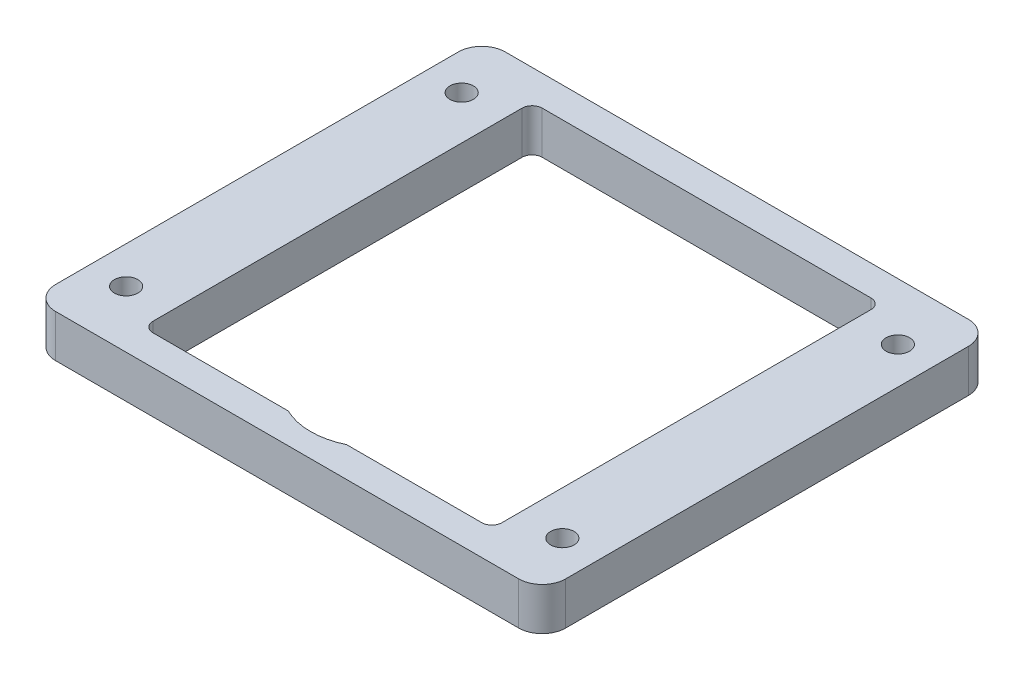
ISO-10303-21;
HEADER;
FILE_DESCRIPTION(('STEP AP214'),'2;1');
FILE_NAME('part.step','',(''),(''),'','','');
FILE_SCHEMA(('AUTOMOTIVE_DESIGN { 1 0 10303 214 1 1 1 1 }'));
ENDSEC;
DATA;
#1=APPLICATION_CONTEXT('core data for automotive mechanical design processes');
#2=APPLICATION_PROTOCOL_DEFINITION('international standard','automotive_design',2000,#1);
#3=PRODUCT_CONTEXT('',#1,'mechanical');
#4=PRODUCT('Part','Part','',(#3));
#5=PRODUCT_RELATED_PRODUCT_CATEGORY('part','',(#4));
#6=PRODUCT_DEFINITION_FORMATION('','',#4);
#7=PRODUCT_DEFINITION_CONTEXT('part definition',#1,'design');
#8=PRODUCT_DEFINITION('design','',#6,#7);
#9=PRODUCT_DEFINITION_SHAPE('','',#8);
#10=(LENGTH_UNIT() NAMED_UNIT(*) SI_UNIT(.MILLI.,.METRE.));
#11=(NAMED_UNIT(*) PLANE_ANGLE_UNIT() SI_UNIT($,.RADIAN.));
#12=(NAMED_UNIT(*) SI_UNIT($,.STERADIAN.) SOLID_ANGLE_UNIT());
#13=UNCERTAINTY_MEASURE_WITH_UNIT(LENGTH_MEASURE(1.E-05),#10,'distance_accuracy_value','');
#14=(GEOMETRIC_REPRESENTATION_CONTEXT(3) GLOBAL_UNCERTAINTY_ASSIGNED_CONTEXT((#13)) GLOBAL_UNIT_ASSIGNED_CONTEXT((#10,
#11,#12)) REPRESENTATION_CONTEXT('',''));
#15=CARTESIAN_POINT('',(0.,0.,0.));
#16=DIRECTION('',(0.,0.,1.));
#17=DIRECTION('',(1.,0.,0.));
#18=AXIS2_PLACEMENT_3D('',#15,#16,#17);
#19=CARTESIAN_POINT('',(24.5,6.35,29.));
#20=DIRECTION('',(0.,0.,-1.));
#21=DIRECTION('',(-1.,0.,0.));
#22=AXIS2_PLACEMENT_3D('',#19,#20,#21);
#23=PLANE('',#22);
#24=DIRECTION('',(0.,1.,0.));
#25=VECTOR('',#24,1.);
#26=CARTESIAN_POINT('',(-4.35889894354068,0.,29.));
#27=LINE('',#26,#25);
#28=CARTESIAN_POINT('',(-4.35889894354068,0.,29.));
#29=VERTEX_POINT('',#28);
#30=CARTESIAN_POINT('',(-4.35889894354068,6.35,29.));
#31=VERTEX_POINT('',#30);
#32=EDGE_CURVE('E11',#29,#31,#27,.T.);
#33=ORIENTED_EDGE('',*,*,#32,.F.);
#34=DIRECTION('',(1.,0.,0.));
#35=VECTOR('',#34,1.);
#36=CARTESIAN_POINT('',(24.5,0.,29.));
#37=LINE('',#36,#35);
#38=CARTESIAN_POINT('',(-24.5,0.,29.));
#39=VERTEX_POINT('',#38);
#40=EDGE_CURVE('E202',#39,#29,#37,.T.);
#41=ORIENTED_EDGE('',*,*,#40,.F.);
#42=DIRECTION('',(0.,-1.,0.));
#43=VECTOR('',#42,1.);
#44=CARTESIAN_POINT('',(-24.5,6.35,29.));
#45=LINE('',#44,#43);
#46=CARTESIAN_POINT('',(-24.5,6.35,29.));
#47=VERTEX_POINT('',#46);
#48=EDGE_CURVE('E174',#47,#39,#45,.T.);
#49=ORIENTED_EDGE('',*,*,#48,.F.);
#50=DIRECTION('',(1.,0.,0.));
#51=VECTOR('',#50,1.);
#52=CARTESIAN_POINT('',(24.5,6.35,29.));
#53=LINE('',#52,#51);
#54=EDGE_CURVE('E169',#47,#31,#53,.T.);
#55=ORIENTED_EDGE('',*,*,#54,.T.);
#56=EDGE_LOOP('',(#33,#41,#49,#55));
#57=FACE_BOUND('',#56,.T.);
#58=ADVANCED_FACE('F34',(#57),#23,.T.);
#59=CARTESIAN_POINT('',(34.5,6.35,-30.));
#60=DIRECTION('',(0.,1.,0.));
#61=DIRECTION('',(0.,0.,1.));
#62=AXIS2_PLACEMENT_3D('',#59,#60,#61);
#63=PLANE('',#62);
#64=CARTESIAN_POINT('',(0.,6.35,20.));
#65=DIRECTION('',(0.,1.,0.));
#66=DIRECTION('',(0.,0.,1.));
#67=AXIS2_PLACEMENT_3D('',#64,#65,#66);
#68=CIRCLE('',#67,10.);
#69=CARTESIAN_POINT('',(4.35889894354068,6.35,29.));
#70=VERTEX_POINT('',#69);
#71=EDGE_CURVE('E48',#31,#70,#68,.T.);
#72=ORIENTED_EDGE('',*,*,#71,.F.);
#73=ORIENTED_EDGE('',*,*,#54,.F.);
#74=CARTESIAN_POINT('',(-24.5,6.35,27.5));
#75=DIRECTION('',(0.,1.,0.));
#76=DIRECTION('',(0.,0.,-1.));
#77=AXIS2_PLACEMENT_3D('',#74,#75,#76);
#78=CIRCLE('',#77,1.5);
#79=CARTESIAN_POINT('',(-26.,6.35,27.5));
#80=VERTEX_POINT('',#79);
#81=EDGE_CURVE('E179',#80,#47,#78,.T.);
#82=ORIENTED_EDGE('',*,*,#81,.F.);
#83=DIRECTION('',(0.,0.,1.));
#84=VECTOR('',#83,1.);
#85=CARTESIAN_POINT('',(-26.,6.35,27.5));
#86=LINE('',#85,#84);
#87=CARTESIAN_POINT('',(-26.,6.35,-27.5));
#88=VERTEX_POINT('',#87);
#89=EDGE_CURVE('E311',#88,#80,#86,.T.);
#90=ORIENTED_EDGE('',*,*,#89,.F.);
#91=CARTESIAN_POINT('',(-24.5,6.35,-27.5));
#92=DIRECTION('',(0.,1.,0.));
#93=DIRECTION('',(0.,0.,1.));
#94=AXIS2_PLACEMENT_3D('',#91,#92,#93);
#95=CIRCLE('',#94,1.5);
#96=CARTESIAN_POINT('',(-24.5,6.35,-29.));
#97=VERTEX_POINT('',#96);
#98=EDGE_CURVE('E306',#97,#88,#95,.T.);
#99=ORIENTED_EDGE('',*,*,#98,.F.);
#100=DIRECTION('',(-1.,0.,0.));
#101=VECTOR('',#100,1.);
#102=CARTESIAN_POINT('',(24.5,6.35,-29.));
#103=LINE('',#102,#101);
#104=CARTESIAN_POINT('',(24.5,6.35,-29.));
#105=VERTEX_POINT('',#104);
#106=EDGE_CURVE('E304',#105,#97,#103,.T.);
#107=ORIENTED_EDGE('',*,*,#106,.F.);
#108=CARTESIAN_POINT('',(24.5,6.35,-27.5));
#109=DIRECTION('',(0.,1.,0.));
#110=DIRECTION('',(0.,0.,1.));
#111=AXIS2_PLACEMENT_3D('',#108,#109,#110);
#112=CIRCLE('',#111,1.5);
#113=CARTESIAN_POINT('',(26.,6.35,-27.5));
#114=VERTEX_POINT('',#113);
#115=EDGE_CURVE('E210',#114,#105,#112,.T.);
#116=ORIENTED_EDGE('',*,*,#115,.F.);
#117=DIRECTION('',(0.,0.,-1.));
#118=VECTOR('',#117,1.);
#119=CARTESIAN_POINT('',(26.,6.35,27.5));
#120=LINE('',#119,#118);
#121=CARTESIAN_POINT('',(26.,6.35,27.5));
#122=VERTEX_POINT('',#121);
#123=EDGE_CURVE('E177',#122,#114,#120,.T.);
#124=ORIENTED_EDGE('',*,*,#123,.F.);
#125=CARTESIAN_POINT('',(24.5,6.35,27.5));
#126=DIRECTION('',(0.,1.,0.));
#127=DIRECTION('',(0.,0.,1.));
#128=AXIS2_PLACEMENT_3D('',#125,#126,#127);
#129=CIRCLE('',#128,1.5);
#130=CARTESIAN_POINT('',(24.5,6.35,29.));
#131=VERTEX_POINT('',#130);
#132=EDGE_CURVE('E175',#131,#122,#129,.T.);
#133=ORIENTED_EDGE('',*,*,#132,.F.);
#134=EDGE_CURVE('E171',#70,#131,#53,.T.);
#135=ORIENTED_EDGE('',*,*,#134,.F.);
#136=EDGE_LOOP('',(#72,#73,#82,#90,#99,#107,#116,#124,#133,#135));
#137=FACE_BOUND('',#136,.T.);
#138=CARTESIAN_POINT('',(-32.5,6.35,25.));
#139=DIRECTION('',(0.,1.,0.));
#140=DIRECTION('',(0.,0.,1.));
#141=AXIS2_PLACEMENT_3D('',#138,#139,#140);
#142=CIRCLE('',#141,1.75);
#143=CARTESIAN_POINT('',(-32.5,6.35,26.75));
#144=VERTEX_POINT('',#143);
#145=EDGE_CURVE('E288',#144,#144,#142,.T.);
#146=ORIENTED_EDGE('',*,*,#145,.F.);
#147=EDGE_LOOP('',(#146));
#148=FACE_BOUND('',#147,.T.);
#149=CARTESIAN_POINT('',(-32.5,6.35,-25.));
#150=DIRECTION('',(0.,1.,0.));
#151=DIRECTION('',(0.,0.,1.));
#152=AXIS2_PLACEMENT_3D('',#149,#150,#151);
#153=CIRCLE('',#152,1.75);
#154=CARTESIAN_POINT('',(-32.5,6.35,-23.25));
#155=VERTEX_POINT('',#154);
#156=EDGE_CURVE('E555',#155,#155,#153,.T.);
#157=ORIENTED_EDGE('',*,*,#156,.F.);
#158=EDGE_LOOP('',(#157));
#159=FACE_BOUND('',#158,.T.);
#160=CARTESIAN_POINT('',(32.5,6.35,25.));
#161=DIRECTION('',(0.,1.,0.));
#162=DIRECTION('',(0.,0.,1.));
#163=AXIS2_PLACEMENT_3D('',#160,#161,#162);
#164=CIRCLE('',#163,1.75);
#165=CARTESIAN_POINT('',(32.5,6.35,26.75));
#166=VERTEX_POINT('',#165);
#167=EDGE_CURVE('E547',#166,#166,#164,.T.);
#168=ORIENTED_EDGE('',*,*,#167,.F.);
#169=EDGE_LOOP('',(#168));
#170=FACE_BOUND('',#169,.T.);
#171=CARTESIAN_POINT('',(32.5,6.35,-25.));
#172=DIRECTION('',(0.,1.,0.));
#173=DIRECTION('',(0.,0.,1.));
#174=AXIS2_PLACEMENT_3D('',#171,#172,#173);
#175=CIRCLE('',#174,1.75);
#176=CARTESIAN_POINT('',(32.5,6.35,-23.25));
#177=VERTEX_POINT('',#176);
#178=EDGE_CURVE('E543',#177,#177,#175,.T.);
#179=ORIENTED_EDGE('',*,*,#178,.F.);
#180=EDGE_LOOP('',(#179));
#181=FACE_BOUND('',#180,.T.);
#182=CARTESIAN_POINT('',(34.5,6.35,-30.));
#183=DIRECTION('',(0.,1.,0.));
#184=DIRECTION('',(0.,0.,1.));
#185=AXIS2_PLACEMENT_3D('',#182,#183,#184);
#186=CIRCLE('',#185,3.5);
#187=CARTESIAN_POINT('',(38.,6.35,-30.));
#188=VERTEX_POINT('',#187);
#189=CARTESIAN_POINT('',(34.5,6.35,-33.5));
#190=VERTEX_POINT('',#189);
#191=EDGE_CURVE('E228',#188,#190,#186,.T.);
#192=ORIENTED_EDGE('',*,*,#191,.T.);
#193=DIRECTION('',(-1.,0.,0.));
#194=VECTOR('',#193,1.);
#195=CARTESIAN_POINT('',(34.5,6.35,-33.5));
#196=LINE('',#195,#194);
#197=CARTESIAN_POINT('',(-34.5,6.35,-33.5));
#198=VERTEX_POINT('',#197);
#199=EDGE_CURVE('E231',#190,#198,#196,.T.);
#200=ORIENTED_EDGE('',*,*,#199,.T.);
#201=CARTESIAN_POINT('',(-34.5,6.35,-30.));
#202=DIRECTION('',(0.,1.,0.));
#203=DIRECTION('',(0.,0.,1.));
#204=AXIS2_PLACEMENT_3D('',#201,#202,#203);
#205=CIRCLE('',#204,3.5);
#206=CARTESIAN_POINT('',(-38.,6.35,-30.));
#207=VERTEX_POINT('',#206);
#208=EDGE_CURVE('E234',#198,#207,#205,.T.);
#209=ORIENTED_EDGE('',*,*,#208,.T.);
#210=DIRECTION('',(0.,0.,1.));
#211=VECTOR('',#210,1.);
#212=CARTESIAN_POINT('',(-38.,6.35,30.));
#213=LINE('',#212,#211);
#214=CARTESIAN_POINT('',(-38.,6.35,30.));
#215=VERTEX_POINT('',#214);
#216=EDGE_CURVE('E236',#207,#215,#213,.T.);
#217=ORIENTED_EDGE('',*,*,#216,.T.);
#218=CARTESIAN_POINT('',(-34.5,6.35,30.));
#219=DIRECTION('',(0.,1.,0.));
#220=DIRECTION('',(0.,0.,-1.));
#221=AXIS2_PLACEMENT_3D('',#218,#219,#220);
#222=CIRCLE('',#221,3.5);
#223=CARTESIAN_POINT('',(-34.5,6.35,33.5));
#224=VERTEX_POINT('',#223);
#225=EDGE_CURVE('E238',#215,#224,#222,.T.);
#226=ORIENTED_EDGE('',*,*,#225,.T.);
#227=DIRECTION('',(1.,0.,0.));
#228=VECTOR('',#227,1.);
#229=CARTESIAN_POINT('',(34.5,6.35,33.5));
#230=LINE('',#229,#228);
#231=CARTESIAN_POINT('',(34.5,6.35,33.5));
#232=VERTEX_POINT('',#231);
#233=EDGE_CURVE('E240',#224,#232,#230,.T.);
#234=ORIENTED_EDGE('',*,*,#233,.T.);
#235=CARTESIAN_POINT('',(34.5,6.35,30.));
#236=DIRECTION('',(0.,1.,0.));
#237=DIRECTION('',(0.,0.,1.));
#238=AXIS2_PLACEMENT_3D('',#235,#236,#237);
#239=CIRCLE('',#238,3.5);
#240=CARTESIAN_POINT('',(38.,6.35,30.));
#241=VERTEX_POINT('',#240);
#242=EDGE_CURVE('E242',#232,#241,#239,.T.);
#243=ORIENTED_EDGE('',*,*,#242,.T.);
#244=DIRECTION('',(0.,0.,-1.));
#245=VECTOR('',#244,1.);
#246=CARTESIAN_POINT('',(38.,6.35,30.));
#247=LINE('',#246,#245);
#248=EDGE_CURVE('E244',#241,#188,#247,.T.);
#249=ORIENTED_EDGE('',*,*,#248,.T.);
#250=EDGE_LOOP('',(#192,#200,#209,#217,#226,#234,#243,#249));
#251=FACE_BOUND('',#250,.T.);
#252=ADVANCED_FACE('F166',(#137,#148,#159,#170,#181,#251),#63,.T.);
#253=CARTESIAN_POINT('',(34.5,0.,-30.));
#254=DIRECTION('',(0.,1.,0.));
#255=DIRECTION('',(0.,0.,1.));
#256=AXIS2_PLACEMENT_3D('',#253,#254,#255);
#257=PLANE('',#256);
#258=CARTESIAN_POINT('',(-32.5,0.,25.));
#259=DIRECTION('',(0.,1.,0.));
#260=DIRECTION('',(0.,0.,1.));
#261=AXIS2_PLACEMENT_3D('',#258,#259,#260);
#262=CIRCLE('',#261,1.75);
#263=CARTESIAN_POINT('',(-32.5,0.,26.75));
#264=VERTEX_POINT('',#263);
#265=EDGE_CURVE('E558',#264,#264,#262,.T.);
#266=ORIENTED_EDGE('',*,*,#265,.T.);
#267=EDGE_LOOP('',(#266));
#268=FACE_BOUND('',#267,.T.);
#269=CARTESIAN_POINT('',(-32.5,0.,-25.));
#270=DIRECTION('',(0.,1.,0.));
#271=DIRECTION('',(0.,0.,1.));
#272=AXIS2_PLACEMENT_3D('',#269,#270,#271);
#273=CIRCLE('',#272,1.75);
#274=CARTESIAN_POINT('',(-32.5,0.,-23.25));
#275=VERTEX_POINT('',#274);
#276=EDGE_CURVE('E552',#275,#275,#273,.T.);
#277=ORIENTED_EDGE('',*,*,#276,.T.);
#278=EDGE_LOOP('',(#277));
#279=FACE_BOUND('',#278,.T.);
#280=CARTESIAN_POINT('',(32.5,0.,25.));
#281=DIRECTION('',(0.,1.,0.));
#282=DIRECTION('',(0.,0.,1.));
#283=AXIS2_PLACEMENT_3D('',#280,#281,#282);
#284=CIRCLE('',#283,1.75);
#285=CARTESIAN_POINT('',(32.5,0.,26.75));
#286=VERTEX_POINT('',#285);
#287=EDGE_CURVE('E545',#286,#286,#284,.T.);
#288=ORIENTED_EDGE('',*,*,#287,.T.);
#289=EDGE_LOOP('',(#288));
#290=FACE_BOUND('',#289,.T.);
#291=CARTESIAN_POINT('',(32.5,0.,-25.));
#292=DIRECTION('',(0.,1.,0.));
#293=DIRECTION('',(0.,0.,1.));
#294=AXIS2_PLACEMENT_3D('',#291,#292,#293);
#295=CIRCLE('',#294,1.75);
#296=CARTESIAN_POINT('',(32.5,0.,-23.25));
#297=VERTEX_POINT('',#296);
#298=EDGE_CURVE('E189',#297,#297,#295,.T.);
#299=ORIENTED_EDGE('',*,*,#298,.T.);
#300=EDGE_LOOP('',(#299));
#301=FACE_BOUND('',#300,.T.);
#302=CARTESIAN_POINT('',(34.5,0.,-30.));
#303=DIRECTION('',(0.,1.,0.));
#304=DIRECTION('',(0.,0.,1.));
#305=AXIS2_PLACEMENT_3D('',#302,#303,#304);
#306=CIRCLE('',#305,3.5);
#307=CARTESIAN_POINT('',(38.,0.,-30.));
#308=VERTEX_POINT('',#307);
#309=CARTESIAN_POINT('',(34.5,0.,-33.5));
#310=VERTEX_POINT('',#309);
#311=EDGE_CURVE('E227',#308,#310,#306,.T.);
#312=ORIENTED_EDGE('',*,*,#311,.F.);
#313=DIRECTION('',(0.,0.,-1.));
#314=VECTOR('',#313,1.);
#315=CARTESIAN_POINT('',(38.,0.,30.));
#316=LINE('',#315,#314);
#317=CARTESIAN_POINT('',(38.,0.,30.));
#318=VERTEX_POINT('',#317);
#319=EDGE_CURVE('E232',#318,#308,#316,.T.);
#320=ORIENTED_EDGE('',*,*,#319,.F.);
#321=CARTESIAN_POINT('',(34.5,0.,30.));
#322=DIRECTION('',(0.,1.,0.));
#323=DIRECTION('',(0.,0.,1.));
#324=AXIS2_PLACEMENT_3D('',#321,#322,#323);
#325=CIRCLE('',#324,3.5);
#326=CARTESIAN_POINT('',(34.5,0.,33.5));
#327=VERTEX_POINT('',#326);
#328=EDGE_CURVE('E259',#327,#318,#325,.T.);
#329=ORIENTED_EDGE('',*,*,#328,.F.);
#330=DIRECTION('',(1.,0.,0.));
#331=VECTOR('',#330,1.);
#332=CARTESIAN_POINT('',(34.5,0.,33.5));
#333=LINE('',#332,#331);
#334=CARTESIAN_POINT('',(-34.5,0.,33.5));
#335=VERTEX_POINT('',#334);
#336=EDGE_CURVE('E257',#335,#327,#333,.T.);
#337=ORIENTED_EDGE('',*,*,#336,.F.);
#338=CARTESIAN_POINT('',(-34.5,0.,30.));
#339=DIRECTION('',(0.,1.,0.));
#340=DIRECTION('',(0.,0.,-1.));
#341=AXIS2_PLACEMENT_3D('',#338,#339,#340);
#342=CIRCLE('',#341,3.5);
#343=CARTESIAN_POINT('',(-38.,0.,30.));
#344=VERTEX_POINT('',#343);
#345=EDGE_CURVE('E255',#344,#335,#342,.T.);
#346=ORIENTED_EDGE('',*,*,#345,.F.);
#347=DIRECTION('',(0.,0.,1.));
#348=VECTOR('',#347,1.);
#349=CARTESIAN_POINT('',(-38.,0.,30.));
#350=LINE('',#349,#348);
#351=CARTESIAN_POINT('',(-38.,0.,-30.));
#352=VERTEX_POINT('',#351);
#353=EDGE_CURVE('E253',#352,#344,#350,.T.);
#354=ORIENTED_EDGE('',*,*,#353,.F.);
#355=CARTESIAN_POINT('',(-34.5,0.,-30.));
#356=DIRECTION('',(0.,1.,0.));
#357=DIRECTION('',(0.,0.,1.));
#358=AXIS2_PLACEMENT_3D('',#355,#356,#357);
#359=CIRCLE('',#358,3.5);
#360=CARTESIAN_POINT('',(-34.5,0.,-33.5));
#361=VERTEX_POINT('',#360);
#362=EDGE_CURVE('E251',#361,#352,#359,.T.);
#363=ORIENTED_EDGE('',*,*,#362,.F.);
#364=DIRECTION('',(-1.,0.,0.));
#365=VECTOR('',#364,1.);
#366=CARTESIAN_POINT('',(34.5,0.,-33.5));
#367=LINE('',#366,#365);
#368=EDGE_CURVE('E249',#310,#361,#367,.T.);
#369=ORIENTED_EDGE('',*,*,#368,.F.);
#370=EDGE_LOOP('',(#312,#320,#329,#337,#346,#354,#363,#369));
#371=FACE_BOUND('',#370,.T.);
#372=ORIENTED_EDGE('',*,*,#40,.T.);
#373=CARTESIAN_POINT('',(0.,0.,20.));
#374=DIRECTION('',(0.,1.,0.));
#375=DIRECTION('',(0.,0.,1.));
#376=AXIS2_PLACEMENT_3D('',#373,#374,#375);
#377=CIRCLE('',#376,10.);
#378=CARTESIAN_POINT('',(4.35889894354068,0.,29.));
#379=VERTEX_POINT('',#378);
#380=EDGE_CURVE('E158',#29,#379,#377,.T.);
#381=ORIENTED_EDGE('',*,*,#380,.T.);
#382=CARTESIAN_POINT('',(24.5,0.,29.));
#383=VERTEX_POINT('',#382);
#384=EDGE_CURVE('E201',#379,#383,#37,.T.);
#385=ORIENTED_EDGE('',*,*,#384,.T.);
#386=CARTESIAN_POINT('',(24.5,0.,27.5));
#387=DIRECTION('',(0.,1.,0.));
#388=DIRECTION('',(0.,0.,1.));
#389=AXIS2_PLACEMENT_3D('',#386,#387,#388);
#390=CIRCLE('',#389,1.5);
#391=CARTESIAN_POINT('',(26.,0.,27.5));
#392=VERTEX_POINT('',#391);
#393=EDGE_CURVE('E204',#383,#392,#390,.T.);
#394=ORIENTED_EDGE('',*,*,#393,.T.);
#395=DIRECTION('',(0.,0.,-1.));
#396=VECTOR('',#395,1.);
#397=CARTESIAN_POINT('',(26.,0.,27.5));
#398=LINE('',#397,#396);
#399=CARTESIAN_POINT('',(26.,0.,-27.5));
#400=VERTEX_POINT('',#399);
#401=EDGE_CURVE('E207',#392,#400,#398,.T.);
#402=ORIENTED_EDGE('',*,*,#401,.T.);
#403=CARTESIAN_POINT('',(24.5,0.,-27.5));
#404=DIRECTION('',(0.,1.,0.));
#405=DIRECTION('',(0.,0.,1.));
#406=AXIS2_PLACEMENT_3D('',#403,#404,#405);
#407=CIRCLE('',#406,1.5);
#408=CARTESIAN_POINT('',(24.5,0.,-29.));
#409=VERTEX_POINT('',#408);
#410=EDGE_CURVE('E185',#400,#409,#407,.T.);
#411=ORIENTED_EDGE('',*,*,#410,.T.);
#412=DIRECTION('',(-1.,0.,0.));
#413=VECTOR('',#412,1.);
#414=CARTESIAN_POINT('',(24.5,0.,-29.));
#415=LINE('',#414,#413);
#416=CARTESIAN_POINT('',(-24.5,0.,-29.));
#417=VERTEX_POINT('',#416);
#418=EDGE_CURVE('E188',#409,#417,#415,.T.);
#419=ORIENTED_EDGE('',*,*,#418,.T.);
#420=CARTESIAN_POINT('',(-24.5,0.,-27.5));
#421=DIRECTION('',(0.,1.,0.));
#422=DIRECTION('',(0.,0.,1.));
#423=AXIS2_PLACEMENT_3D('',#420,#421,#422);
#424=CIRCLE('',#423,1.5);
#425=CARTESIAN_POINT('',(-26.,0.,-27.5));
#426=VERTEX_POINT('',#425);
#427=EDGE_CURVE('E192',#417,#426,#424,.T.);
#428=ORIENTED_EDGE('',*,*,#427,.T.);
#429=DIRECTION('',(0.,0.,1.));
#430=VECTOR('',#429,1.);
#431=CARTESIAN_POINT('',(-26.,0.,27.5));
#432=LINE('',#431,#430);
#433=CARTESIAN_POINT('',(-26.,0.,27.5));
#434=VERTEX_POINT('',#433);
#435=EDGE_CURVE('E195',#426,#434,#432,.T.);
#436=ORIENTED_EDGE('',*,*,#435,.T.);
#437=CARTESIAN_POINT('',(-24.5,0.,27.5));
#438=DIRECTION('',(0.,1.,0.));
#439=DIRECTION('',(0.,0.,-1.));
#440=AXIS2_PLACEMENT_3D('',#437,#438,#439);
#441=CIRCLE('',#440,1.5);
#442=EDGE_CURVE('E198',#434,#39,#441,.T.);
#443=ORIENTED_EDGE('',*,*,#442,.T.);
#444=EDGE_LOOP('',(#372,#381,#385,#394,#402,#411,#419,#428,#436,#443));
#445=FACE_BOUND('',#444,.T.);
#446=ADVANCED_FACE('F287',(#268,#279,#290,#301,#371,#445),#257,.F.);
#447=CARTESIAN_POINT('',(34.5,6.35,-30.));
#448=DIRECTION('',(0.,-1.,0.));
#449=DIRECTION('',(0.,0.,-1.));
#450=AXIS2_PLACEMENT_3D('',#447,#448,#449);
#451=CYLINDRICAL_SURFACE('',#450,3.5);
#452=ORIENTED_EDGE('',*,*,#311,.T.);
#453=DIRECTION('',(0.,-1.,0.));
#454=VECTOR('',#453,1.);
#455=CARTESIAN_POINT('',(34.5,6.35,-33.5));
#456=LINE('',#455,#454);
#457=EDGE_CURVE('E282',#190,#310,#456,.T.);
#458=ORIENTED_EDGE('',*,*,#457,.F.);
#459=ORIENTED_EDGE('',*,*,#191,.F.);
#460=DIRECTION('',(0.,-1.,0.));
#461=VECTOR('',#460,1.);
#462=CARTESIAN_POINT('',(38.,6.35,-30.));
#463=LINE('',#462,#461);
#464=EDGE_CURVE('E246',#188,#308,#463,.T.);
#465=ORIENTED_EDGE('',*,*,#464,.T.);
#466=EDGE_LOOP('',(#452,#458,#459,#465));
#467=FACE_BOUND('',#466,.T.);
#468=ADVANCED_FACE('F36',(#467),#451,.T.);
#469=CARTESIAN_POINT('',(34.5,6.35,-33.5));
#470=DIRECTION('',(0.,0.,1.));
#471=DIRECTION('',(1.,0.,0.));
#472=AXIS2_PLACEMENT_3D('',#469,#470,#471);
#473=PLANE('',#472);
#474=ORIENTED_EDGE('',*,*,#368,.T.);
#475=DIRECTION('',(0.,-1.,0.));
#476=VECTOR('',#475,1.);
#477=CARTESIAN_POINT('',(-34.5,6.35,-33.5));
#478=LINE('',#477,#476);
#479=EDGE_CURVE('E279',#198,#361,#478,.T.);
#480=ORIENTED_EDGE('',*,*,#479,.F.);
#481=ORIENTED_EDGE('',*,*,#199,.F.);
#482=ORIENTED_EDGE('',*,*,#457,.T.);
#483=EDGE_LOOP('',(#474,#480,#481,#482));
#484=FACE_BOUND('',#483,.T.);
#485=ADVANCED_FACE('F428',(#484),#473,.F.);
#486=CARTESIAN_POINT('',(-34.5,6.35,-30.));
#487=DIRECTION('',(0.,-1.,0.));
#488=DIRECTION('',(0.,0.,-1.));
#489=AXIS2_PLACEMENT_3D('',#486,#487,#488);
#490=CYLINDRICAL_SURFACE('',#489,3.5);
#491=ORIENTED_EDGE('',*,*,#362,.T.);
#492=DIRECTION('',(0.,-1.,0.));
#493=VECTOR('',#492,1.);
#494=CARTESIAN_POINT('',(-38.,6.35,-30.));
#495=LINE('',#494,#493);
#496=EDGE_CURVE('E276',#207,#352,#495,.T.);
#497=ORIENTED_EDGE('',*,*,#496,.F.);
#498=ORIENTED_EDGE('',*,*,#208,.F.);
#499=ORIENTED_EDGE('',*,*,#479,.T.);
#500=EDGE_LOOP('',(#491,#497,#498,#499));
#501=FACE_BOUND('',#500,.T.);
#502=ADVANCED_FACE('F418',(#501),#490,.T.);
#503=CARTESIAN_POINT('',(-38.,6.35,30.));
#504=DIRECTION('',(1.,0.,0.));
#505=DIRECTION('',(0.,0.,-1.));
#506=AXIS2_PLACEMENT_3D('',#503,#504,#505);
#507=PLANE('',#506);
#508=ORIENTED_EDGE('',*,*,#353,.T.);
#509=DIRECTION('',(0.,-1.,0.));
#510=VECTOR('',#509,1.);
#511=CARTESIAN_POINT('',(-38.,6.35,30.));
#512=LINE('',#511,#510);
#513=EDGE_CURVE('E273',#215,#344,#512,.T.);
#514=ORIENTED_EDGE('',*,*,#513,.F.);
#515=ORIENTED_EDGE('',*,*,#216,.F.);
#516=ORIENTED_EDGE('',*,*,#496,.T.);
#517=EDGE_LOOP('',(#508,#514,#515,#516));
#518=FACE_BOUND('',#517,.T.);
#519=ADVANCED_FACE('F408',(#518),#507,.F.);
#520=CARTESIAN_POINT('',(-34.5,6.35,30.));
#521=DIRECTION('',(0.,-1.,0.));
#522=DIRECTION('',(0.,0.,-1.));
#523=AXIS2_PLACEMENT_3D('',#520,#521,#522);
#524=CYLINDRICAL_SURFACE('',#523,3.5);
#525=ORIENTED_EDGE('',*,*,#345,.T.);
#526=DIRECTION('',(0.,-1.,0.));
#527=VECTOR('',#526,1.);
#528=CARTESIAN_POINT('',(-34.5,6.35,33.5));
#529=LINE('',#528,#527);
#530=EDGE_CURVE('E270',#224,#335,#529,.T.);
#531=ORIENTED_EDGE('',*,*,#530,.F.);
#532=ORIENTED_EDGE('',*,*,#225,.F.);
#533=ORIENTED_EDGE('',*,*,#513,.T.);
#534=EDGE_LOOP('',(#525,#531,#532,#533));
#535=FACE_BOUND('',#534,.T.);
#536=ADVANCED_FACE('F398',(#535),#524,.T.);
#537=CARTESIAN_POINT('',(34.5,6.35,33.5));
#538=DIRECTION('',(0.,0.,-1.));
#539=DIRECTION('',(-1.,0.,0.));
#540=AXIS2_PLACEMENT_3D('',#537,#538,#539);
#541=PLANE('',#540);
#542=ORIENTED_EDGE('',*,*,#336,.T.);
#543=DIRECTION('',(0.,-1.,0.));
#544=VECTOR('',#543,1.);
#545=CARTESIAN_POINT('',(34.5,6.35,33.5));
#546=LINE('',#545,#544);
#547=EDGE_CURVE('E267',#232,#327,#546,.T.);
#548=ORIENTED_EDGE('',*,*,#547,.F.);
#549=ORIENTED_EDGE('',*,*,#233,.F.);
#550=ORIENTED_EDGE('',*,*,#530,.T.);
#551=EDGE_LOOP('',(#542,#548,#549,#550));
#552=FACE_BOUND('',#551,.T.);
#553=ADVANCED_FACE('F388',(#552),#541,.F.);
#554=CARTESIAN_POINT('',(34.5,6.35,30.));
#555=DIRECTION('',(0.,-1.,0.));
#556=DIRECTION('',(0.,0.,-1.));
#557=AXIS2_PLACEMENT_3D('',#554,#555,#556);
#558=CYLINDRICAL_SURFACE('',#557,3.5);
#559=ORIENTED_EDGE('',*,*,#328,.T.);
#560=DIRECTION('',(0.,-1.,0.));
#561=VECTOR('',#560,1.);
#562=CARTESIAN_POINT('',(38.,6.35,30.));
#563=LINE('',#562,#561);
#564=EDGE_CURVE('E264',#241,#318,#563,.T.);
#565=ORIENTED_EDGE('',*,*,#564,.F.);
#566=ORIENTED_EDGE('',*,*,#242,.F.);
#567=ORIENTED_EDGE('',*,*,#547,.T.);
#568=EDGE_LOOP('',(#559,#565,#566,#567));
#569=FACE_BOUND('',#568,.T.);
#570=ADVANCED_FACE('F378',(#569),#558,.T.);
#571=CARTESIAN_POINT('',(38.,6.35,30.));
#572=DIRECTION('',(-1.,0.,0.));
#573=DIRECTION('',(0.,0.,1.));
#574=AXIS2_PLACEMENT_3D('',#571,#572,#573);
#575=PLANE('',#574);
#576=ORIENTED_EDGE('',*,*,#319,.T.);
#577=ORIENTED_EDGE('',*,*,#464,.F.);
#578=ORIENTED_EDGE('',*,*,#248,.F.);
#579=ORIENTED_EDGE('',*,*,#564,.T.);
#580=EDGE_LOOP('',(#576,#577,#578,#579));
#581=FACE_BOUND('',#580,.T.);
#582=ADVANCED_FACE('F334',(#581),#575,.F.);
#583=CARTESIAN_POINT('',(24.5,6.35,-27.5));
#584=DIRECTION('',(0.,-1.,0.));
#585=DIRECTION('',(0.,0.,-1.));
#586=AXIS2_PLACEMENT_3D('',#583,#584,#585);
#587=CYLINDRICAL_SURFACE('',#586,1.5);
#588=ORIENTED_EDGE('',*,*,#410,.F.);
#589=DIRECTION('',(0.,-1.,0.));
#590=VECTOR('',#589,1.);
#591=CARTESIAN_POINT('',(26.,6.35,-27.5));
#592=LINE('',#591,#590);
#593=EDGE_CURVE('E184',#114,#400,#592,.T.);
#594=ORIENTED_EDGE('',*,*,#593,.F.);
#595=ORIENTED_EDGE('',*,*,#115,.T.);
#596=DIRECTION('',(0.,-1.,0.));
#597=VECTOR('',#596,1.);
#598=CARTESIAN_POINT('',(24.5,6.35,-29.));
#599=LINE('',#598,#597);
#600=EDGE_CURVE('E224',#105,#409,#599,.T.);
#601=ORIENTED_EDGE('',*,*,#600,.T.);
#602=EDGE_LOOP('',(#588,#594,#595,#601));
#603=FACE_BOUND('',#602,.T.);
#604=ADVANCED_FACE('F300',(#603),#587,.F.);
#605=CARTESIAN_POINT('',(24.5,6.35,-29.));
#606=DIRECTION('',(0.,0.,1.));
#607=DIRECTION('',(1.,0.,0.));
#608=AXIS2_PLACEMENT_3D('',#605,#606,#607);
#609=PLANE('',#608);
#610=ORIENTED_EDGE('',*,*,#418,.F.);
#611=ORIENTED_EDGE('',*,*,#600,.F.);
#612=ORIENTED_EDGE('',*,*,#106,.T.);
#613=DIRECTION('',(0.,-1.,0.));
#614=VECTOR('',#613,1.);
#615=CARTESIAN_POINT('',(-24.5,6.35,-29.));
#616=LINE('',#615,#614);
#617=EDGE_CURVE('E222',#97,#417,#616,.T.);
#618=ORIENTED_EDGE('',*,*,#617,.T.);
#619=EDGE_LOOP('',(#610,#611,#612,#618));
#620=FACE_BOUND('',#619,.T.);
#621=ADVANCED_FACE('F326',(#620),#609,.T.);
#622=CARTESIAN_POINT('',(-24.5,6.35,-27.5));
#623=DIRECTION('',(0.,-1.,0.));
#624=DIRECTION('',(0.,0.,-1.));
#625=AXIS2_PLACEMENT_3D('',#622,#623,#624);
#626=CYLINDRICAL_SURFACE('',#625,1.5);
#627=ORIENTED_EDGE('',*,*,#427,.F.);
#628=ORIENTED_EDGE('',*,*,#617,.F.);
#629=ORIENTED_EDGE('',*,*,#98,.T.);
#630=DIRECTION('',(0.,-1.,0.));
#631=VECTOR('',#630,1.);
#632=CARTESIAN_POINT('',(-26.,6.35,-27.5));
#633=LINE('',#632,#631);
#634=EDGE_CURVE('E220',#88,#426,#633,.T.);
#635=ORIENTED_EDGE('',*,*,#634,.T.);
#636=EDGE_LOOP('',(#627,#628,#629,#635));
#637=FACE_BOUND('',#636,.T.);
#638=ADVANCED_FACE('F322',(#637),#626,.F.);
#639=CARTESIAN_POINT('',(-26.,6.35,27.5));
#640=DIRECTION('',(1.,0.,0.));
#641=DIRECTION('',(0.,0.,-1.));
#642=AXIS2_PLACEMENT_3D('',#639,#640,#641);
#643=PLANE('',#642);
#644=ORIENTED_EDGE('',*,*,#435,.F.);
#645=ORIENTED_EDGE('',*,*,#634,.F.);
#646=ORIENTED_EDGE('',*,*,#89,.T.);
#647=DIRECTION('',(0.,-1.,0.));
#648=VECTOR('',#647,1.);
#649=CARTESIAN_POINT('',(-26.,6.35,27.5));
#650=LINE('',#649,#648);
#651=EDGE_CURVE('E218',#80,#434,#650,.T.);
#652=ORIENTED_EDGE('',*,*,#651,.T.);
#653=EDGE_LOOP('',(#644,#645,#646,#652));
#654=FACE_BOUND('',#653,.T.);
#655=ADVANCED_FACE('F324',(#654),#643,.T.);
#656=CARTESIAN_POINT('',(-24.5,6.35,27.5));
#657=DIRECTION('',(0.,-1.,0.));
#658=DIRECTION('',(0.,0.,-1.));
#659=AXIS2_PLACEMENT_3D('',#656,#657,#658);
#660=CYLINDRICAL_SURFACE('',#659,1.5);
#661=ORIENTED_EDGE('',*,*,#442,.F.);
#662=ORIENTED_EDGE('',*,*,#651,.F.);
#663=ORIENTED_EDGE('',*,*,#81,.T.);
#664=ORIENTED_EDGE('',*,*,#48,.T.);
#665=EDGE_LOOP('',(#661,#662,#663,#664));
#666=FACE_BOUND('',#665,.T.);
#667=ADVANCED_FACE('F318',(#666),#660,.F.);
#668=DIRECTION('',(0.,1.,0.));
#669=VECTOR('',#668,1.);
#670=CARTESIAN_POINT('',(4.35889894354068,0.,29.));
#671=LINE('',#670,#669);
#672=EDGE_CURVE('E42',#70,#379,#671,.F.);
#673=ORIENTED_EDGE('',*,*,#672,.F.);
#674=ORIENTED_EDGE('',*,*,#134,.T.);
#675=DIRECTION('',(0.,-1.,0.));
#676=VECTOR('',#675,1.);
#677=CARTESIAN_POINT('',(24.5,6.35,29.));
#678=LINE('',#677,#676);
#679=EDGE_CURVE('E214',#131,#383,#678,.T.);
#680=ORIENTED_EDGE('',*,*,#679,.T.);
#681=ORIENTED_EDGE('',*,*,#384,.F.);
#682=EDGE_LOOP('',(#673,#674,#680,#681));
#683=FACE_BOUND('',#682,.T.);
#684=ADVANCED_FACE('F290',(#683),#23,.T.);
#685=CARTESIAN_POINT('',(24.5,6.35,27.5));
#686=DIRECTION('',(0.,-1.,0.));
#687=DIRECTION('',(0.,0.,-1.));
#688=AXIS2_PLACEMENT_3D('',#685,#686,#687);
#689=CYLINDRICAL_SURFACE('',#688,1.5);
#690=ORIENTED_EDGE('',*,*,#393,.F.);
#691=ORIENTED_EDGE('',*,*,#679,.F.);
#692=ORIENTED_EDGE('',*,*,#132,.T.);
#693=DIRECTION('',(0.,-1.,0.));
#694=VECTOR('',#693,1.);
#695=CARTESIAN_POINT('',(26.,6.35,27.5));
#696=LINE('',#695,#694);
#697=EDGE_CURVE('E56',#122,#392,#696,.T.);
#698=ORIENTED_EDGE('',*,*,#697,.T.);
#699=EDGE_LOOP('',(#690,#691,#692,#698));
#700=FACE_BOUND('',#699,.T.);
#701=ADVANCED_FACE('F294',(#700),#689,.F.);
#702=CARTESIAN_POINT('',(26.,6.35,27.5));
#703=DIRECTION('',(-1.,0.,0.));
#704=DIRECTION('',(0.,0.,1.));
#705=AXIS2_PLACEMENT_3D('',#702,#703,#704);
#706=PLANE('',#705);
#707=ORIENTED_EDGE('',*,*,#401,.F.);
#708=ORIENTED_EDGE('',*,*,#697,.F.);
#709=ORIENTED_EDGE('',*,*,#123,.T.);
#710=ORIENTED_EDGE('',*,*,#593,.T.);
#711=EDGE_LOOP('',(#707,#708,#709,#710));
#712=FACE_BOUND('',#711,.T.);
#713=ADVANCED_FACE('F295',(#712),#706,.T.);
#714=CARTESIAN_POINT('',(32.5,6.35,-25.));
#715=DIRECTION('',(0.,1.,0.));
#716=DIRECTION('',(0.,0.,1.));
#717=AXIS2_PLACEMENT_3D('',#714,#715,#716);
#718=CYLINDRICAL_SURFACE('',#717,1.75);
#719=ORIENTED_EDGE('',*,*,#298,.F.);
#720=EDGE_LOOP('',(#719));
#721=FACE_BOUND('',#720,.T.);
#722=ORIENTED_EDGE('',*,*,#178,.T.);
#723=EDGE_LOOP('',(#722));
#724=FACE_BOUND('',#723,.T.);
#725=ADVANCED_FACE('F494',(#721,#724),#718,.F.);
#726=CARTESIAN_POINT('',(32.5,6.35,25.));
#727=DIRECTION('',(0.,1.,0.));
#728=DIRECTION('',(0.,0.,1.));
#729=AXIS2_PLACEMENT_3D('',#726,#727,#728);
#730=CYLINDRICAL_SURFACE('',#729,1.75);
#731=ORIENTED_EDGE('',*,*,#287,.F.);
#732=EDGE_LOOP('',(#731));
#733=FACE_BOUND('',#732,.T.);
#734=ORIENTED_EDGE('',*,*,#167,.T.);
#735=EDGE_LOOP('',(#734));
#736=FACE_BOUND('',#735,.T.);
#737=ADVANCED_FACE('F484',(#733,#736),#730,.F.);
#738=CARTESIAN_POINT('',(-32.5,6.35,-25.));
#739=DIRECTION('',(0.,1.,0.));
#740=DIRECTION('',(0.,0.,1.));
#741=AXIS2_PLACEMENT_3D('',#738,#739,#740);
#742=CYLINDRICAL_SURFACE('',#741,1.75);
#743=ORIENTED_EDGE('',*,*,#276,.F.);
#744=EDGE_LOOP('',(#743));
#745=FACE_BOUND('',#744,.T.);
#746=ORIENTED_EDGE('',*,*,#156,.T.);
#747=EDGE_LOOP('',(#746));
#748=FACE_BOUND('',#747,.T.);
#749=ADVANCED_FACE('F473',(#745,#748),#742,.F.);
#750=CARTESIAN_POINT('',(-32.5,6.35,25.));
#751=DIRECTION('',(0.,1.,0.));
#752=DIRECTION('',(0.,0.,1.));
#753=AXIS2_PLACEMENT_3D('',#750,#751,#752);
#754=CYLINDRICAL_SURFACE('',#753,1.75);
#755=ORIENTED_EDGE('',*,*,#265,.F.);
#756=EDGE_LOOP('',(#755));
#757=FACE_BOUND('',#756,.T.);
#758=ORIENTED_EDGE('',*,*,#145,.T.);
#759=EDGE_LOOP('',(#758));
#760=FACE_BOUND('',#759,.T.);
#761=ADVANCED_FACE('F469',(#757,#760),#754,.F.);
#762=CARTESIAN_POINT('',(0.,0.,20.));
#763=DIRECTION('',(0.,1.,0.));
#764=DIRECTION('',(0.,0.,1.));
#765=AXIS2_PLACEMENT_3D('',#762,#763,#764);
#766=CYLINDRICAL_SURFACE('',#765,10.);
#767=ORIENTED_EDGE('',*,*,#32,.T.);
#768=ORIENTED_EDGE('',*,*,#71,.T.);
#769=ORIENTED_EDGE('',*,*,#672,.T.);
#770=ORIENTED_EDGE('',*,*,#380,.F.);
#771=EDGE_LOOP('',(#767,#768,#769,#770));
#772=FACE_BOUND('',#771,.T.);
#773=ADVANCED_FACE('F156',(#772),#766,.F.);
#774=CLOSED_SHELL('',(#58,#252,#446,#468,#485,#502,#519,#536,#553,#570,#582,#604,#621,#638,#655,
#667,#684,#701,#713,#725,#737,#749,#761,#773));
#775=MANIFOLD_SOLID_BREP('B2',#774);
#776=ADVANCED_BREP_SHAPE_REPRESENTATION('',(#18,#775),#14);
#777=SHAPE_DEFINITION_REPRESENTATION(#9,#776);
ENDSEC;
END-ISO-10303-21;
